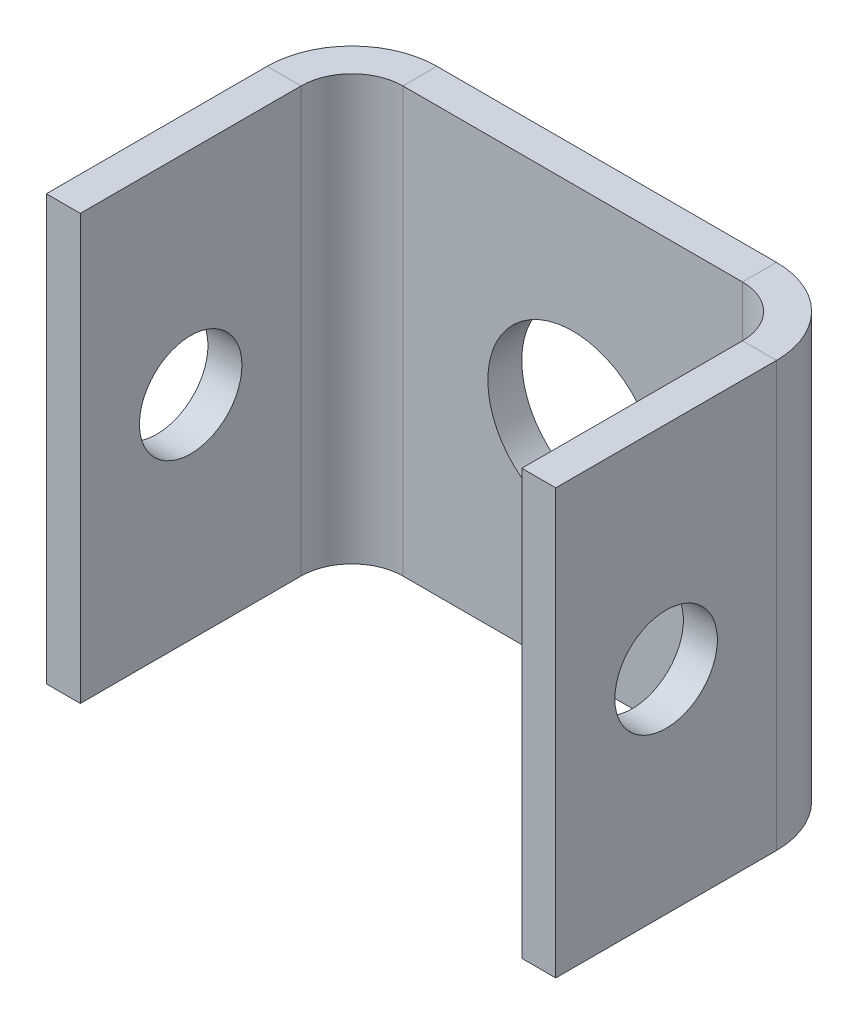
ISO-10303-21;
HEADER;
FILE_DESCRIPTION(('STEP AP214'),'2;1');
FILE_NAME('part.step','',(''),(''),'','','');
FILE_SCHEMA(('AUTOMOTIVE_DESIGN { 1 0 10303 214 1 1 1 1 }'));
ENDSEC;
DATA;
#1=APPLICATION_CONTEXT('core data for automotive mechanical design processes');
#2=APPLICATION_PROTOCOL_DEFINITION('international standard','automotive_design',2000,#1);
#3=PRODUCT_CONTEXT('',#1,'mechanical');
#4=PRODUCT('Part','Part','',(#3));
#5=PRODUCT_RELATED_PRODUCT_CATEGORY('part','',(#4));
#6=PRODUCT_DEFINITION_FORMATION('','',#4);
#7=PRODUCT_DEFINITION_CONTEXT('part definition',#1,'design');
#8=PRODUCT_DEFINITION('design','',#6,#7);
#9=PRODUCT_DEFINITION_SHAPE('','',#8);
#10=(LENGTH_UNIT() NAMED_UNIT(*) SI_UNIT(.MILLI.,.METRE.));
#11=(NAMED_UNIT(*) PLANE_ANGLE_UNIT() SI_UNIT($,.RADIAN.));
#12=(NAMED_UNIT(*) SI_UNIT($,.STERADIAN.) SOLID_ANGLE_UNIT());
#13=UNCERTAINTY_MEASURE_WITH_UNIT(LENGTH_MEASURE(1.E-05),#10,'distance_accuracy_value','');
#14=(GEOMETRIC_REPRESENTATION_CONTEXT(3) GLOBAL_UNCERTAINTY_ASSIGNED_CONTEXT((#13)) GLOBAL_UNIT_ASSIGNED_CONTEXT((#10,
#11,#12)) REPRESENTATION_CONTEXT('',''));
#15=CARTESIAN_POINT('',(0.,0.,0.));
#16=DIRECTION('',(0.,0.,1.));
#17=DIRECTION('',(1.,0.,0.));
#18=AXIS2_PLACEMENT_3D('',#15,#16,#17);
#19=CARTESIAN_POINT('',(15.,12.5,-13.));
#20=DIRECTION('',(0.,1.,0.));
#21=DIRECTION('',(0.,0.,1.));
#22=AXIS2_PLACEMENT_3D('',#19,#20,#21);
#23=PLANE('',#22);
#24=DIRECTION('',(-1.,0.,0.));
#25=VECTOR('',#24,1.);
#26=CARTESIAN_POINT('',(15.,12.5,-13.));
#27=LINE('',#26,#25);
#28=CARTESIAN_POINT('',(15.,12.5,-13.));
#29=VERTEX_POINT('',#28);
#30=CARTESIAN_POINT('',(13.,12.5,-13.));
#31=VERTEX_POINT('',#30);
#32=EDGE_CURVE('E11',#29,#31,#27,.T.);
#33=ORIENTED_EDGE('',*,*,#32,.F.);
#34=CARTESIAN_POINT('',(10.,12.5,-13.));
#35=DIRECTION('',(0.,-1.,0.));
#36=DIRECTION('',(0.,0.,-1.));
#37=AXIS2_PLACEMENT_3D('',#34,#35,#36);
#38=CIRCLE('',#37,5.);
#39=CARTESIAN_POINT('',(10.,12.5,-18.));
#40=VERTEX_POINT('',#39);
#41=EDGE_CURVE('E149',#29,#40,#38,.F.);
#42=ORIENTED_EDGE('',*,*,#41,.T.);
#43=DIRECTION('',(0.,0.,-1.));
#44=VECTOR('',#43,1.);
#45=CARTESIAN_POINT('',(10.,12.5,-16.));
#46=LINE('',#45,#44);
#47=CARTESIAN_POINT('',(10.,12.5,-16.));
#48=VERTEX_POINT('',#47);
#49=EDGE_CURVE('E46',#48,#40,#46,.T.);
#50=ORIENTED_EDGE('',*,*,#49,.F.);
#51=CARTESIAN_POINT('',(10.,12.5,-13.));
#52=DIRECTION('',(0.,1.,0.));
#53=DIRECTION('',(1.,0.,0.));
#54=AXIS2_PLACEMENT_3D('',#51,#52,#53);
#55=CIRCLE('',#54,3.);
#56=EDGE_CURVE('E244',#31,#48,#55,.T.);
#57=ORIENTED_EDGE('',*,*,#56,.F.);
#58=EDGE_LOOP('',(#33,#42,#50,#57));
#59=FACE_BOUND('',#58,.T.);
#60=ADVANCED_FACE('F37',(#59),#23,.T.);
#61=CARTESIAN_POINT('',(10.,12.5,-16.));
#62=DIRECTION('',(0.,1.,0.));
#63=DIRECTION('',(0.,0.,1.));
#64=AXIS2_PLACEMENT_3D('',#61,#62,#63);
#65=PLANE('',#64);
#66=DIRECTION('',(0.,0.,-1.));
#67=VECTOR('',#66,1.);
#68=CARTESIAN_POINT('',(15.,12.5,-18.));
#69=LINE('',#68,#67);
#70=CARTESIAN_POINT('',(15.,12.5,0.));
#71=VERTEX_POINT('',#70);
#72=EDGE_CURVE('E154',#71,#29,#69,.T.);
#73=ORIENTED_EDGE('',*,*,#72,.T.);
#74=ORIENTED_EDGE('',*,*,#32,.T.);
#75=DIRECTION('',(0.,0.,-1.));
#76=VECTOR('',#75,1.);
#77=CARTESIAN_POINT('',(13.,12.5,-18.));
#78=LINE('',#77,#76);
#79=CARTESIAN_POINT('',(13.,12.5,0.));
#80=VERTEX_POINT('',#79);
#81=EDGE_CURVE('E257',#80,#31,#78,.T.);
#82=ORIENTED_EDGE('',*,*,#81,.F.);
#83=DIRECTION('',(-1.,0.,0.));
#84=VECTOR('',#83,1.);
#85=CARTESIAN_POINT('',(15.,12.5,0.));
#86=LINE('',#85,#84);
#87=EDGE_CURVE('E259',#71,#80,#86,.T.);
#88=ORIENTED_EDGE('',*,*,#87,.F.);
#89=EDGE_LOOP('',(#73,#74,#82,#88));
#90=FACE_BOUND('',#89,.T.);
#91=ADVANCED_FACE('F270',(#90),#65,.T.);
#92=CARTESIAN_POINT('',(10.,-12.5,-18.));
#93=DIRECTION('',(0.,-1.,0.));
#94=DIRECTION('',(0.,0.,-1.));
#95=AXIS2_PLACEMENT_3D('',#92,#93,#94);
#96=PLANE('',#95);
#97=DIRECTION('',(0.,0.,1.));
#98=VECTOR('',#97,1.);
#99=CARTESIAN_POINT('',(10.,-12.5,-18.));
#100=LINE('',#99,#98);
#101=CARTESIAN_POINT('',(10.,-12.5,-18.));
#102=VERTEX_POINT('',#101);
#103=CARTESIAN_POINT('',(10.,-12.5,-16.));
#104=VERTEX_POINT('',#103);
#105=EDGE_CURVE('E146',#102,#104,#100,.T.);
#106=ORIENTED_EDGE('',*,*,#105,.F.);
#107=CARTESIAN_POINT('',(10.,-12.5,-13.));
#108=DIRECTION('',(0.,-1.,0.));
#109=DIRECTION('',(0.,0.,-1.));
#110=AXIS2_PLACEMENT_3D('',#107,#108,#109);
#111=CIRCLE('',#110,5.);
#112=CARTESIAN_POINT('',(15.,-12.5,-13.));
#113=VERTEX_POINT('',#112);
#114=EDGE_CURVE('E161',#113,#102,#111,.F.);
#115=ORIENTED_EDGE('',*,*,#114,.F.);
#116=DIRECTION('',(1.,0.,0.));
#117=VECTOR('',#116,1.);
#118=CARTESIAN_POINT('',(13.,-12.5,-13.));
#119=LINE('',#118,#117);
#120=CARTESIAN_POINT('',(13.,-12.5,-13.));
#121=VERTEX_POINT('',#120);
#122=EDGE_CURVE('E235',#121,#113,#119,.T.);
#123=ORIENTED_EDGE('',*,*,#122,.F.);
#124=CARTESIAN_POINT('',(10.,-12.5,-13.));
#125=DIRECTION('',(0.,1.,0.));
#126=DIRECTION('',(1.,0.,0.));
#127=AXIS2_PLACEMENT_3D('',#124,#125,#126);
#128=CIRCLE('',#127,3.);
#129=EDGE_CURVE('E189',#121,#104,#128,.T.);
#130=ORIENTED_EDGE('',*,*,#129,.T.);
#131=EDGE_LOOP('',(#106,#115,#123,#130));
#132=FACE_BOUND('',#131,.T.);
#133=ADVANCED_FACE('F249',(#132),#96,.T.);
#134=CARTESIAN_POINT('',(13.,-12.5,-13.));
#135=DIRECTION('',(0.,-1.,0.));
#136=DIRECTION('',(0.,0.,-1.));
#137=AXIS2_PLACEMENT_3D('',#134,#135,#136);
#138=PLANE('',#137);
#139=DIRECTION('',(-1.,0.,0.));
#140=VECTOR('',#139,1.);
#141=CARTESIAN_POINT('',(-15.,-12.5,-18.));
#142=LINE('',#141,#140);
#143=CARTESIAN_POINT('',(-10.,-12.5,-18.));
#144=VERTEX_POINT('',#143);
#145=EDGE_CURVE('E202',#102,#144,#142,.T.);
#146=ORIENTED_EDGE('',*,*,#145,.F.);
#147=ORIENTED_EDGE('',*,*,#105,.T.);
#148=DIRECTION('',(-1.,0.,0.));
#149=VECTOR('',#148,1.);
#150=CARTESIAN_POINT('',(-15.,-12.5,-16.));
#151=LINE('',#150,#149);
#152=CARTESIAN_POINT('',(-10.,-12.5,-16.));
#153=VERTEX_POINT('',#152);
#154=EDGE_CURVE('E187',#104,#153,#151,.T.);
#155=ORIENTED_EDGE('',*,*,#154,.T.);
#156=DIRECTION('',(0.,0.,-1.));
#157=VECTOR('',#156,1.);
#158=CARTESIAN_POINT('',(-10.,-12.5,-16.));
#159=LINE('',#158,#157);
#160=EDGE_CURVE('E95',#153,#144,#159,.T.);
#161=ORIENTED_EDGE('',*,*,#160,.T.);
#162=EDGE_LOOP('',(#146,#147,#155,#161));
#163=FACE_BOUND('',#162,.T.);
#164=ADVANCED_FACE('F237',(#163),#138,.T.);
#165=CARTESIAN_POINT('',(-10.,12.5,-18.));
#166=DIRECTION('',(0.,1.,0.));
#167=DIRECTION('',(0.,0.,1.));
#168=AXIS2_PLACEMENT_3D('',#165,#166,#167);
#169=PLANE('',#168);
#170=DIRECTION('',(0.,0.,1.));
#171=VECTOR('',#170,1.);
#172=CARTESIAN_POINT('',(-10.,12.5,-18.));
#173=LINE('',#172,#171);
#174=CARTESIAN_POINT('',(-10.,12.5,-18.));
#175=VERTEX_POINT('',#174);
#176=CARTESIAN_POINT('',(-10.,12.5,-16.));
#177=VERTEX_POINT('',#176);
#178=EDGE_CURVE('E233',#175,#177,#173,.T.);
#179=ORIENTED_EDGE('',*,*,#178,.F.);
#180=CARTESIAN_POINT('',(-10.,12.5,-13.));
#181=DIRECTION('',(0.,-1.,0.));
#182=DIRECTION('',(0.,0.,-1.));
#183=AXIS2_PLACEMENT_3D('',#180,#181,#182);
#184=CIRCLE('',#183,5.);
#185=CARTESIAN_POINT('',(-15.,12.5,-13.));
#186=VERTEX_POINT('',#185);
#187=EDGE_CURVE('E169',#175,#186,#184,.F.);
#188=ORIENTED_EDGE('',*,*,#187,.T.);
#189=DIRECTION('',(-1.,0.,0.));
#190=VECTOR('',#189,1.);
#191=CARTESIAN_POINT('',(-13.,12.5,-13.));
#192=LINE('',#191,#190);
#193=CARTESIAN_POINT('',(-13.,12.5,-13.));
#194=VERTEX_POINT('',#193);
#195=EDGE_CURVE('E54',#194,#186,#192,.T.);
#196=ORIENTED_EDGE('',*,*,#195,.F.);
#197=CARTESIAN_POINT('',(-10.,12.5,-13.));
#198=DIRECTION('',(0.,1.,0.));
#199=DIRECTION('',(1.,0.,0.));
#200=AXIS2_PLACEMENT_3D('',#197,#198,#199);
#201=CIRCLE('',#200,3.);
#202=EDGE_CURVE('E261',#177,#194,#201,.T.);
#203=ORIENTED_EDGE('',*,*,#202,.F.);
#204=EDGE_LOOP('',(#179,#188,#196,#203));
#205=FACE_BOUND('',#204,.T.);
#206=ADVANCED_FACE('F298',(#205),#169,.T.);
#207=CARTESIAN_POINT('',(-13.,12.5,-13.));
#208=DIRECTION('',(0.,1.,0.));
#209=DIRECTION('',(0.,0.,1.));
#210=AXIS2_PLACEMENT_3D('',#207,#208,#209);
#211=PLANE('',#210);
#212=DIRECTION('',(-1.,0.,0.));
#213=VECTOR('',#212,1.);
#214=CARTESIAN_POINT('',(-15.,12.5,-18.));
#215=LINE('',#214,#213);
#216=EDGE_CURVE('E138',#40,#175,#215,.T.);
#217=ORIENTED_EDGE('',*,*,#216,.T.);
#218=ORIENTED_EDGE('',*,*,#178,.T.);
#219=DIRECTION('',(-1.,0.,0.));
#220=VECTOR('',#219,1.);
#221=CARTESIAN_POINT('',(-15.,12.5,-16.));
#222=LINE('',#221,#220);
#223=EDGE_CURVE('E141',#48,#177,#222,.T.);
#224=ORIENTED_EDGE('',*,*,#223,.F.);
#225=ORIENTED_EDGE('',*,*,#49,.T.);
#226=EDGE_LOOP('',(#217,#218,#224,#225));
#227=FACE_BOUND('',#226,.T.);
#228=ADVANCED_FACE('F136',(#227),#211,.T.);
#229=CARTESIAN_POINT('',(-15.,-12.5,-13.));
#230=DIRECTION('',(0.,-1.,0.));
#231=DIRECTION('',(0.,0.,-1.));
#232=AXIS2_PLACEMENT_3D('',#229,#230,#231);
#233=PLANE('',#232);
#234=DIRECTION('',(1.,0.,0.));
#235=VECTOR('',#234,1.);
#236=CARTESIAN_POINT('',(-15.,-12.5,-13.));
#237=LINE('',#236,#235);
#238=CARTESIAN_POINT('',(-15.,-12.5,-13.));
#239=VERTEX_POINT('',#238);
#240=CARTESIAN_POINT('',(-13.,-12.5,-13.));
#241=VERTEX_POINT('',#240);
#242=EDGE_CURVE('E102',#239,#241,#237,.T.);
#243=ORIENTED_EDGE('',*,*,#242,.F.);
#244=CARTESIAN_POINT('',(-10.,-12.5,-13.));
#245=DIRECTION('',(0.,-1.,0.));
#246=DIRECTION('',(0.,0.,-1.));
#247=AXIS2_PLACEMENT_3D('',#244,#245,#246);
#248=CIRCLE('',#247,5.);
#249=EDGE_CURVE('E204',#144,#239,#248,.F.);
#250=ORIENTED_EDGE('',*,*,#249,.F.);
#251=ORIENTED_EDGE('',*,*,#160,.F.);
#252=CARTESIAN_POINT('',(-10.,-12.5,-13.));
#253=DIRECTION('',(0.,1.,0.));
#254=DIRECTION('',(1.,0.,0.));
#255=AXIS2_PLACEMENT_3D('',#252,#253,#254);
#256=CIRCLE('',#255,3.);
#257=EDGE_CURVE('E185',#153,#241,#256,.T.);
#258=ORIENTED_EDGE('',*,*,#257,.T.);
#259=EDGE_LOOP('',(#243,#250,#251,#258));
#260=FACE_BOUND('',#259,.T.);
#261=ADVANCED_FACE('F304',(#260),#233,.T.);
#262=CARTESIAN_POINT('',(-10.,-12.5,-16.));
#263=DIRECTION('',(0.,-1.,0.));
#264=DIRECTION('',(0.,0.,-1.));
#265=AXIS2_PLACEMENT_3D('',#262,#263,#264);
#266=PLANE('',#265);
#267=DIRECTION('',(0.,0.,1.));
#268=VECTOR('',#267,1.);
#269=CARTESIAN_POINT('',(-15.,-12.5,-18.));
#270=LINE('',#269,#268);
#271=CARTESIAN_POINT('',(-15.,-12.5,0.));
#272=VERTEX_POINT('',#271);
#273=EDGE_CURVE('E175',#239,#272,#270,.T.);
#274=ORIENTED_EDGE('',*,*,#273,.F.);
#275=ORIENTED_EDGE('',*,*,#242,.T.);
#276=DIRECTION('',(0.,0.,1.));
#277=VECTOR('',#276,1.);
#278=CARTESIAN_POINT('',(-13.,-12.5,-18.));
#279=LINE('',#278,#277);
#280=CARTESIAN_POINT('',(-13.,-12.5,0.));
#281=VERTEX_POINT('',#280);
#282=EDGE_CURVE('E182',#241,#281,#279,.T.);
#283=ORIENTED_EDGE('',*,*,#282,.T.);
#284=DIRECTION('',(-1.,0.,0.));
#285=VECTOR('',#284,1.);
#286=CARTESIAN_POINT('',(-13.,-12.5,0.));
#287=LINE('',#286,#285);
#288=EDGE_CURVE('E178',#281,#272,#287,.T.);
#289=ORIENTED_EDGE('',*,*,#288,.T.);
#290=EDGE_LOOP('',(#274,#275,#283,#289));
#291=FACE_BOUND('',#290,.T.);
#292=ADVANCED_FACE('F307',(#291),#266,.T.);
#293=CARTESIAN_POINT('',(-15.,12.5,-18.));
#294=DIRECTION('',(1.,0.,0.));
#295=DIRECTION('',(0.,0.,-1.));
#296=AXIS2_PLACEMENT_3D('',#293,#294,#295);
#297=PLANE('',#296);
#298=CARTESIAN_POINT('',(-15.,0.,-6.49999999999999));
#299=DIRECTION('',(1.,0.,0.));
#300=DIRECTION('',(0.,0.,-1.));
#301=AXIS2_PLACEMENT_3D('',#298,#299,#300);
#302=CIRCLE('',#301,3.01839067068399);
#303=CARTESIAN_POINT('',(-15.,0.,-9.51839067068398));
#304=VERTEX_POINT('',#303);
#305=EDGE_CURVE('E572',#304,#304,#302,.T.);
#306=ORIENTED_EDGE('',*,*,#305,.T.);
#307=EDGE_LOOP('',(#306));
#308=FACE_BOUND('',#307,.T.);
#309=ORIENTED_EDGE('',*,*,#273,.T.);
#310=DIRECTION('',(0.,-1.,0.));
#311=VECTOR('',#310,1.);
#312=CARTESIAN_POINT('',(-15.,12.5,0.));
#313=LINE('',#312,#311);
#314=CARTESIAN_POINT('',(-15.,12.5,0.));
#315=VERTEX_POINT('',#314);
#316=EDGE_CURVE('E228',#315,#272,#313,.T.);
#317=ORIENTED_EDGE('',*,*,#316,.F.);
#318=DIRECTION('',(0.,0.,1.));
#319=VECTOR('',#318,1.);
#320=CARTESIAN_POINT('',(-15.,12.5,-18.));
#321=LINE('',#320,#319);
#322=EDGE_CURVE('E108',#186,#315,#321,.T.);
#323=ORIENTED_EDGE('',*,*,#322,.F.);
#324=DIRECTION('',(0.,-1.,0.));
#325=VECTOR('',#324,1.);
#326=CARTESIAN_POINT('',(-15.,12.5,-13.));
#327=LINE('',#326,#325);
#328=EDGE_CURVE('E171',#186,#239,#327,.T.);
#329=ORIENTED_EDGE('',*,*,#328,.T.);
#330=EDGE_LOOP('',(#309,#317,#323,#329));
#331=FACE_BOUND('',#330,.T.);
#332=ADVANCED_FACE('F310',(#308,#331),#297,.F.);
#333=CARTESIAN_POINT('',(-13.,12.5,0.));
#334=DIRECTION('',(0.,0.,1.));
#335=DIRECTION('',(1.,0.,0.));
#336=AXIS2_PLACEMENT_3D('',#333,#334,#335);
#337=PLANE('',#336);
#338=ORIENTED_EDGE('',*,*,#288,.F.);
#339=DIRECTION('',(0.,-1.,0.));
#340=VECTOR('',#339,1.);
#341=CARTESIAN_POINT('',(-13.,12.5,0.));
#342=LINE('',#341,#340);
#343=CARTESIAN_POINT('',(-13.,12.5,0.));
#344=VERTEX_POINT('',#343);
#345=EDGE_CURVE('E226',#344,#281,#342,.T.);
#346=ORIENTED_EDGE('',*,*,#345,.F.);
#347=DIRECTION('',(-1.,0.,0.));
#348=VECTOR('',#347,1.);
#349=CARTESIAN_POINT('',(-13.,12.5,0.));
#350=LINE('',#349,#348);
#351=EDGE_CURVE('E556',#344,#315,#350,.T.);
#352=ORIENTED_EDGE('',*,*,#351,.T.);
#353=ORIENTED_EDGE('',*,*,#316,.T.);
#354=EDGE_LOOP('',(#338,#346,#352,#353));
#355=FACE_BOUND('',#354,.T.);
#356=ADVANCED_FACE('F314',(#355),#337,.T.);
#357=CARTESIAN_POINT('',(-13.,12.5,-18.));
#358=DIRECTION('',(1.,0.,0.));
#359=DIRECTION('',(0.,0.,-1.));
#360=AXIS2_PLACEMENT_3D('',#357,#358,#359);
#361=PLANE('',#360);
#362=CARTESIAN_POINT('',(-13.,0.,-6.49999999999999));
#363=DIRECTION('',(1.,0.,0.));
#364=DIRECTION('',(0.,0.,-1.));
#365=AXIS2_PLACEMENT_3D('',#362,#363,#364);
#366=CIRCLE('',#365,3.01839067068399);
#367=CARTESIAN_POINT('',(-13.,0.,-9.51839067068398));
#368=VERTEX_POINT('',#367);
#369=EDGE_CURVE('E179',#368,#368,#366,.T.);
#370=ORIENTED_EDGE('',*,*,#369,.F.);
#371=EDGE_LOOP('',(#370));
#372=FACE_BOUND('',#371,.T.);
#373=ORIENTED_EDGE('',*,*,#282,.F.);
#374=DIRECTION('',(0.,-1.,0.));
#375=VECTOR('',#374,1.);
#376=CARTESIAN_POINT('',(-13.,12.5,-13.));
#377=LINE('',#376,#375);
#378=EDGE_CURVE('E223',#194,#241,#377,.T.);
#379=ORIENTED_EDGE('',*,*,#378,.F.);
#380=DIRECTION('',(0.,0.,1.));
#381=VECTOR('',#380,1.);
#382=CARTESIAN_POINT('',(-13.,12.5,-18.));
#383=LINE('',#382,#381);
#384=EDGE_CURVE('E558',#194,#344,#383,.T.);
#385=ORIENTED_EDGE('',*,*,#384,.T.);
#386=ORIENTED_EDGE('',*,*,#345,.T.);
#387=EDGE_LOOP('',(#373,#379,#385,#386));
#388=FACE_BOUND('',#387,.T.);
#389=ADVANCED_FACE('F318',(#372,#388),#361,.T.);
#390=CARTESIAN_POINT('',(-10.,12.5,-13.));
#391=DIRECTION('',(0.,-1.,0.));
#392=DIRECTION('',(0.,0.,-1.));
#393=AXIS2_PLACEMENT_3D('',#390,#391,#392);
#394=CYLINDRICAL_SURFACE('',#393,3.);
#395=ORIENTED_EDGE('',*,*,#257,.F.);
#396=DIRECTION('',(0.,-1.,0.));
#397=VECTOR('',#396,1.);
#398=CARTESIAN_POINT('',(-10.,12.5,-16.));
#399=LINE('',#398,#397);
#400=EDGE_CURVE('E220',#177,#153,#399,.T.);
#401=ORIENTED_EDGE('',*,*,#400,.F.);
#402=ORIENTED_EDGE('',*,*,#202,.T.);
#403=ORIENTED_EDGE('',*,*,#378,.T.);
#404=EDGE_LOOP('',(#395,#401,#402,#403));
#405=FACE_BOUND('',#404,.T.);
#406=ADVANCED_FACE('F322',(#405),#394,.F.);
#407=CARTESIAN_POINT('',(-15.,12.5,-16.));
#408=DIRECTION('',(0.,0.,1.));
#409=DIRECTION('',(1.,0.,0.));
#410=AXIS2_PLACEMENT_3D('',#407,#408,#409);
#411=PLANE('',#410);
#412=CARTESIAN_POINT('',(0.,0.,-16.));
#413=DIRECTION('',(0.,0.,1.));
#414=DIRECTION('',(1.,0.,0.));
#415=AXIS2_PLACEMENT_3D('',#412,#413,#414);
#416=CIRCLE('',#415,5.);
#417=CARTESIAN_POINT('',(5.,0.,-16.));
#418=VERTEX_POINT('',#417);
#419=EDGE_CURVE('E576',#418,#418,#416,.F.);
#420=ORIENTED_EDGE('',*,*,#419,.T.);
#421=EDGE_LOOP('',(#420));
#422=FACE_BOUND('',#421,.T.);
#423=ORIENTED_EDGE('',*,*,#154,.F.);
#424=DIRECTION('',(0.,-1.,0.));
#425=VECTOR('',#424,1.);
#426=CARTESIAN_POINT('',(10.,12.5,-16.));
#427=LINE('',#426,#425);
#428=EDGE_CURVE('E217',#48,#104,#427,.T.);
#429=ORIENTED_EDGE('',*,*,#428,.F.);
#430=ORIENTED_EDGE('',*,*,#223,.T.);
#431=ORIENTED_EDGE('',*,*,#400,.T.);
#432=EDGE_LOOP('',(#423,#429,#430,#431));
#433=FACE_BOUND('',#432,.T.);
#434=ADVANCED_FACE('F246',(#422,#433),#411,.T.);
#435=CARTESIAN_POINT('',(10.,12.5,-13.));
#436=DIRECTION('',(0.,-1.,0.));
#437=DIRECTION('',(0.,0.,-1.));
#438=AXIS2_PLACEMENT_3D('',#435,#436,#437);
#439=CYLINDRICAL_SURFACE('',#438,3.);
#440=ORIENTED_EDGE('',*,*,#129,.F.);
#441=DIRECTION('',(0.,-1.,0.));
#442=VECTOR('',#441,1.);
#443=CARTESIAN_POINT('',(13.,12.5,-13.));
#444=LINE('',#443,#442);
#445=EDGE_CURVE('E214',#31,#121,#444,.T.);
#446=ORIENTED_EDGE('',*,*,#445,.F.);
#447=ORIENTED_EDGE('',*,*,#56,.T.);
#448=ORIENTED_EDGE('',*,*,#428,.T.);
#449=EDGE_LOOP('',(#440,#446,#447,#448));
#450=FACE_BOUND('',#449,.T.);
#451=ADVANCED_FACE('F242',(#450),#439,.F.);
#452=CARTESIAN_POINT('',(13.,12.5,-18.));
#453=DIRECTION('',(-1.,0.,0.));
#454=DIRECTION('',(0.,0.,1.));
#455=AXIS2_PLACEMENT_3D('',#452,#453,#454);
#456=PLANE('',#455);
#457=CARTESIAN_POINT('',(13.,0.,-6.5));
#458=DIRECTION('',(-1.,0.,0.));
#459=DIRECTION('',(0.,0.,1.));
#460=AXIS2_PLACEMENT_3D('',#457,#458,#459);
#461=CIRCLE('',#460,3.01839067068399);
#462=CARTESIAN_POINT('',(13.,0.,-3.48160932931601));
#463=VERTEX_POINT('',#462);
#464=EDGE_CURVE('E569',#463,#463,#461,.T.);
#465=ORIENTED_EDGE('',*,*,#464,.F.);
#466=EDGE_LOOP('',(#465));
#467=FACE_BOUND('',#466,.T.);
#468=DIRECTION('',(0.,0.,-1.));
#469=VECTOR('',#468,1.);
#470=CARTESIAN_POINT('',(13.,-12.5,-18.));
#471=LINE('',#470,#469);
#472=CARTESIAN_POINT('',(13.,-12.5,0.));
#473=VERTEX_POINT('',#472);
#474=EDGE_CURVE('E192',#473,#121,#471,.T.);
#475=ORIENTED_EDGE('',*,*,#474,.F.);
#476=DIRECTION('',(0.,-1.,0.));
#477=VECTOR('',#476,1.);
#478=CARTESIAN_POINT('',(13.,12.5,0.));
#479=LINE('',#478,#477);
#480=EDGE_CURVE('E212',#80,#473,#479,.T.);
#481=ORIENTED_EDGE('',*,*,#480,.F.);
#482=ORIENTED_EDGE('',*,*,#81,.T.);
#483=ORIENTED_EDGE('',*,*,#445,.T.);
#484=EDGE_LOOP('',(#475,#481,#482,#483));
#485=FACE_BOUND('',#484,.T.);
#486=ADVANCED_FACE('F255',(#467,#485),#456,.T.);
#487=CARTESIAN_POINT('',(15.,12.5,0.));
#488=DIRECTION('',(0.,0.,1.));
#489=DIRECTION('',(1.,0.,0.));
#490=AXIS2_PLACEMENT_3D('',#487,#488,#489);
#491=PLANE('',#490);
#492=DIRECTION('',(-1.,0.,0.));
#493=VECTOR('',#492,1.);
#494=CARTESIAN_POINT('',(15.,-12.5,0.));
#495=LINE('',#494,#493);
#496=CARTESIAN_POINT('',(15.,-12.5,0.));
#497=VERTEX_POINT('',#496);
#498=EDGE_CURVE('E195',#497,#473,#495,.T.);
#499=ORIENTED_EDGE('',*,*,#498,.F.);
#500=DIRECTION('',(0.,-1.,0.));
#501=VECTOR('',#500,1.);
#502=CARTESIAN_POINT('',(15.,12.5,0.));
#503=LINE('',#502,#501);
#504=EDGE_CURVE('E210',#71,#497,#503,.T.);
#505=ORIENTED_EDGE('',*,*,#504,.F.);
#506=ORIENTED_EDGE('',*,*,#87,.T.);
#507=ORIENTED_EDGE('',*,*,#480,.T.);
#508=EDGE_LOOP('',(#499,#505,#506,#507));
#509=FACE_BOUND('',#508,.T.);
#510=ADVANCED_FACE('F276',(#509),#491,.T.);
#511=CARTESIAN_POINT('',(15.,12.5,-18.));
#512=DIRECTION('',(-1.,0.,0.));
#513=DIRECTION('',(0.,0.,1.));
#514=AXIS2_PLACEMENT_3D('',#511,#512,#513);
#515=PLANE('',#514);
#516=CARTESIAN_POINT('',(15.,0.,-6.5));
#517=DIRECTION('',(-1.,0.,0.));
#518=DIRECTION('',(0.,0.,1.));
#519=AXIS2_PLACEMENT_3D('',#516,#517,#518);
#520=CIRCLE('',#519,3.01839067068399);
#521=CARTESIAN_POINT('',(15.,0.,-3.48160932931601));
#522=VERTEX_POINT('',#521);
#523=EDGE_CURVE('E40',#522,#522,#520,.T.);
#524=ORIENTED_EDGE('',*,*,#523,.T.);
#525=EDGE_LOOP('',(#524));
#526=FACE_BOUND('',#525,.T.);
#527=DIRECTION('',(0.,0.,-1.));
#528=VECTOR('',#527,1.);
#529=CARTESIAN_POINT('',(15.,-12.5,-18.));
#530=LINE('',#529,#528);
#531=EDGE_CURVE('E198',#497,#113,#530,.T.);
#532=ORIENTED_EDGE('',*,*,#531,.T.);
#533=DIRECTION('',(0.,-1.,0.));
#534=VECTOR('',#533,1.);
#535=CARTESIAN_POINT('',(15.,12.5,-13.));
#536=LINE('',#535,#534);
#537=EDGE_CURVE('E163',#29,#113,#536,.T.);
#538=ORIENTED_EDGE('',*,*,#537,.F.);
#539=ORIENTED_EDGE('',*,*,#72,.F.);
#540=ORIENTED_EDGE('',*,*,#504,.T.);
#541=EDGE_LOOP('',(#532,#538,#539,#540));
#542=FACE_BOUND('',#541,.T.);
#543=ADVANCED_FACE('F272',(#526,#542),#515,.F.);
#544=CARTESIAN_POINT('',(10.,12.5,-13.));
#545=DIRECTION('',(0.,-1.,0.));
#546=DIRECTION('',(0.,0.,-1.));
#547=AXIS2_PLACEMENT_3D('',#544,#545,#546);
#548=CYLINDRICAL_SURFACE('',#547,5.);
#549=ORIENTED_EDGE('',*,*,#114,.T.);
#550=DIRECTION('',(0.,-1.,0.));
#551=VECTOR('',#550,1.);
#552=CARTESIAN_POINT('',(10.,12.5,-18.));
#553=LINE('',#552,#551);
#554=EDGE_CURVE('E158',#40,#102,#553,.T.);
#555=ORIENTED_EDGE('',*,*,#554,.F.);
#556=ORIENTED_EDGE('',*,*,#41,.F.);
#557=ORIENTED_EDGE('',*,*,#537,.T.);
#558=EDGE_LOOP('',(#549,#555,#556,#557));
#559=FACE_BOUND('',#558,.T.);
#560=ADVANCED_FACE('F159',(#559),#548,.T.);
#561=CARTESIAN_POINT('',(-15.,12.5,-18.));
#562=DIRECTION('',(0.,0.,1.));
#563=DIRECTION('',(1.,0.,0.));
#564=AXIS2_PLACEMENT_3D('',#561,#562,#563);
#565=PLANE('',#564);
#566=CARTESIAN_POINT('',(0.,0.,-18.));
#567=DIRECTION('',(0.,0.,-1.));
#568=DIRECTION('',(-1.,0.,0.));
#569=AXIS2_PLACEMENT_3D('',#566,#567,#568);
#570=CIRCLE('',#569,5.);
#571=CARTESIAN_POINT('',(-5.,0.,-18.));
#572=VERTEX_POINT('',#571);
#573=EDGE_CURVE('E575',#572,#572,#570,.T.);
#574=ORIENTED_EDGE('',*,*,#573,.F.);
#575=EDGE_LOOP('',(#574));
#576=FACE_BOUND('',#575,.T.);
#577=ORIENTED_EDGE('',*,*,#145,.T.);
#578=DIRECTION('',(0.,-1.,0.));
#579=VECTOR('',#578,1.);
#580=CARTESIAN_POINT('',(-10.,12.5,-18.));
#581=LINE('',#580,#579);
#582=EDGE_CURVE('E164',#175,#144,#581,.T.);
#583=ORIENTED_EDGE('',*,*,#582,.F.);
#584=ORIENTED_EDGE('',*,*,#216,.F.);
#585=ORIENTED_EDGE('',*,*,#554,.T.);
#586=EDGE_LOOP('',(#577,#583,#584,#585));
#587=FACE_BOUND('',#586,.T.);
#588=ADVANCED_FACE('F166',(#576,#587),#565,.F.);
#589=CARTESIAN_POINT('',(-10.,12.5,-13.));
#590=DIRECTION('',(0.,-1.,0.));
#591=DIRECTION('',(0.,0.,-1.));
#592=AXIS2_PLACEMENT_3D('',#589,#590,#591);
#593=CYLINDRICAL_SURFACE('',#592,5.);
#594=ORIENTED_EDGE('',*,*,#249,.T.);
#595=ORIENTED_EDGE('',*,*,#328,.F.);
#596=ORIENTED_EDGE('',*,*,#187,.F.);
#597=ORIENTED_EDGE('',*,*,#582,.T.);
#598=EDGE_LOOP('',(#594,#595,#596,#597));
#599=FACE_BOUND('',#598,.T.);
#600=ADVANCED_FACE('F396',(#599),#593,.T.);
#601=CARTESIAN_POINT('',(-10.,12.5,-13.));
#602=DIRECTION('',(0.,1.,0.));
#603=DIRECTION('',(1.,0.,0.));
#604=AXIS2_PLACEMENT_3D('',#601,#602,#603);
#605=PLANE('',#604);
#606=ORIENTED_EDGE('',*,*,#322,.T.);
#607=ORIENTED_EDGE('',*,*,#351,.F.);
#608=ORIENTED_EDGE('',*,*,#384,.F.);
#609=ORIENTED_EDGE('',*,*,#195,.T.);
#610=EDGE_LOOP('',(#606,#607,#608,#609));
#611=FACE_BOUND('',#610,.T.);
#612=ADVANCED_FACE('F459',(#611),#605,.T.);
#613=CARTESIAN_POINT('',(-10.,-12.5,-13.));
#614=DIRECTION('',(0.,1.,0.));
#615=DIRECTION('',(1.,0.,0.));
#616=AXIS2_PLACEMENT_3D('',#613,#614,#615);
#617=PLANE('',#616);
#618=ORIENTED_EDGE('',*,*,#474,.T.);
#619=ORIENTED_EDGE('',*,*,#122,.T.);
#620=ORIENTED_EDGE('',*,*,#531,.F.);
#621=ORIENTED_EDGE('',*,*,#498,.T.);
#622=EDGE_LOOP('',(#618,#619,#620,#621));
#623=FACE_BOUND('',#622,.T.);
#624=ADVANCED_FACE('F274',(#623),#617,.F.);
#625=CARTESIAN_POINT('',(-15.,0.,-6.49999999999999));
#626=DIRECTION('',(1.,0.,0.));
#627=DIRECTION('',(0.,0.,-1.));
#628=AXIS2_PLACEMENT_3D('',#625,#626,#627);
#629=CYLINDRICAL_SURFACE('',#628,3.01839067068399);
#630=ORIENTED_EDGE('',*,*,#464,.T.);
#631=EDGE_LOOP('',(#630));
#632=FACE_BOUND('',#631,.T.);
#633=ORIENTED_EDGE('',*,*,#523,.F.);
#634=EDGE_LOOP('',(#633));
#635=FACE_BOUND('',#634,.T.);
#636=ADVANCED_FACE('F360',(#632,#635),#629,.F.);
#637=ORIENTED_EDGE('',*,*,#369,.T.);
#638=EDGE_LOOP('',(#637));
#639=FACE_BOUND('',#638,.T.);
#640=ORIENTED_EDGE('',*,*,#305,.F.);
#641=EDGE_LOOP('',(#640));
#642=FACE_BOUND('',#641,.T.);
#643=ADVANCED_FACE('F365',(#639,#642),#629,.F.);
#644=CARTESIAN_POINT('',(0.,0.,0.00100000000000447));
#645=DIRECTION('',(0.,0.,-1.));
#646=DIRECTION('',(-1.,0.,0.));
#647=AXIS2_PLACEMENT_3D('',#644,#645,#646);
#648=CYLINDRICAL_SURFACE('',#647,5.);
#649=ORIENTED_EDGE('',*,*,#419,.F.);
#650=EDGE_LOOP('',(#649));
#651=FACE_BOUND('',#650,.T.);
#652=ORIENTED_EDGE('',*,*,#573,.T.);
#653=EDGE_LOOP('',(#652));
#654=FACE_BOUND('',#653,.T.);
#655=ADVANCED_FACE('F377',(#651,#654),#648,.F.);
#656=CLOSED_SHELL('',(#60,#91,#133,#164,#206,#228,#261,#292,#332,#356,#389,#406,#434,#451,#486,
#510,#543,#560,#588,#600,#612,#624,#636,#643,#655));
#657=MANIFOLD_SOLID_BREP('B2',#656);
#658=ADVANCED_BREP_SHAPE_REPRESENTATION('',(#18,#657),#14);
#659=SHAPE_DEFINITION_REPRESENTATION(#9,#658);
ENDSEC;
END-ISO-10303-21;
